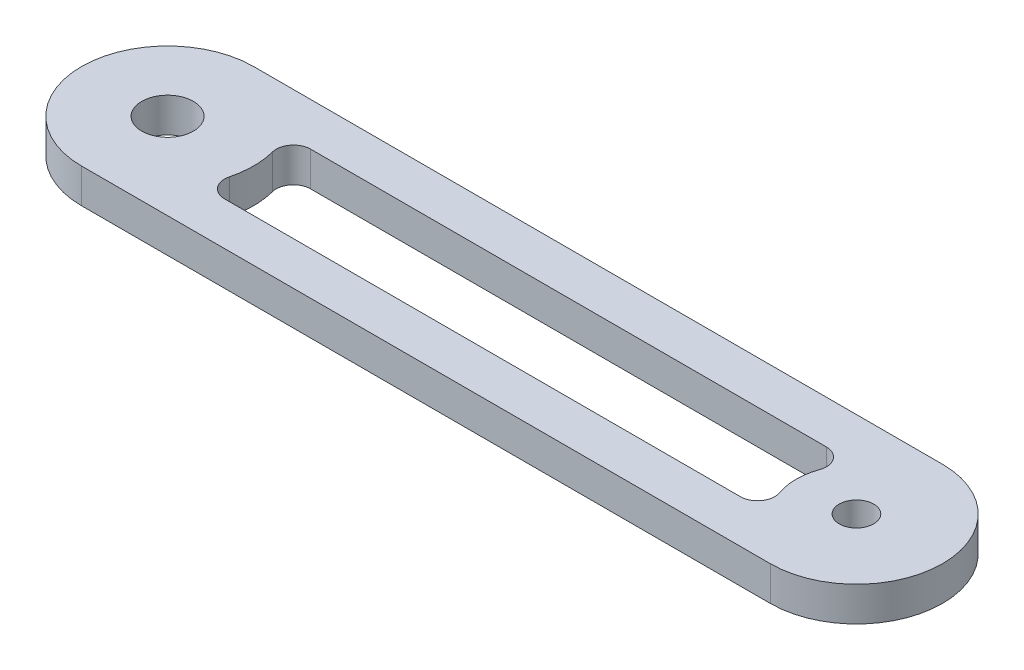
ISO-10303-21;
HEADER;
FILE_DESCRIPTION(('STEP AP214'),'2;1');
FILE_NAME('part.step','',(''),(''),'','','');
FILE_SCHEMA(('AUTOMOTIVE_DESIGN { 1 0 10303 214 1 1 1 1 }'));
ENDSEC;
DATA;
#1=APPLICATION_CONTEXT('core data for automotive mechanical design processes');
#2=APPLICATION_PROTOCOL_DEFINITION('international standard','automotive_design',2000,#1);
#3=PRODUCT_CONTEXT('',#1,'mechanical');
#4=PRODUCT('Part','Part','',(#3));
#5=PRODUCT_RELATED_PRODUCT_CATEGORY('part','',(#4));
#6=PRODUCT_DEFINITION_FORMATION('','',#4);
#7=PRODUCT_DEFINITION_CONTEXT('part definition',#1,'design');
#8=PRODUCT_DEFINITION('design','',#6,#7);
#9=PRODUCT_DEFINITION_SHAPE('','',#8);
#10=(LENGTH_UNIT() NAMED_UNIT(*) SI_UNIT(.MILLI.,.METRE.));
#11=(NAMED_UNIT(*) PLANE_ANGLE_UNIT() SI_UNIT($,.RADIAN.));
#12=(NAMED_UNIT(*) SI_UNIT($,.STERADIAN.) SOLID_ANGLE_UNIT());
#13=UNCERTAINTY_MEASURE_WITH_UNIT(LENGTH_MEASURE(1.E-05),#10,'distance_accuracy_value','');
#14=(GEOMETRIC_REPRESENTATION_CONTEXT(3) GLOBAL_UNCERTAINTY_ASSIGNED_CONTEXT((#13)) GLOBAL_UNIT_ASSIGNED_CONTEXT((#10,
#11,#12)) REPRESENTATION_CONTEXT('',''));
#15=CARTESIAN_POINT('',(0.,0.,0.));
#16=DIRECTION('',(0.,0.,1.));
#17=DIRECTION('',(1.,0.,0.));
#18=AXIS2_PLACEMENT_3D('',#15,#16,#17);
#19=CARTESIAN_POINT('',(-20.,2.,0.));
#20=DIRECTION('',(0.,1.,0.));
#21=DIRECTION('',(0.,0.,1.));
#22=AXIS2_PLACEMENT_3D('',#19,#20,#21);
#23=PLANE('',#22);
#24=CARTESIAN_POINT('',(-20.,2.,0.));
#25=DIRECTION('',(0.,1.,0.));
#26=DIRECTION('',(0.,0.,1.));
#27=AXIS2_PLACEMENT_3D('',#24,#25,#26);
#28=CIRCLE('',#27,5.00000000000001);
#29=CARTESIAN_POINT('',(-20.,2.,-5.00000000000001));
#30=VERTEX_POINT('',#29);
#31=CARTESIAN_POINT('',(-20.,2.,5.00000000000001));
#32=VERTEX_POINT('',#31);
#33=EDGE_CURVE('E184',#30,#32,#28,.T.);
#34=ORIENTED_EDGE('',*,*,#33,.T.);
#35=DIRECTION('',(1.,0.,0.));
#36=VECTOR('',#35,1.);
#37=CARTESIAN_POINT('',(-20.,2.,5.00000000000001));
#38=LINE('',#37,#36);
#39=CARTESIAN_POINT('',(20.,2.,5.));
#40=VERTEX_POINT('',#39);
#41=EDGE_CURVE('E187',#32,#40,#38,.T.);
#42=ORIENTED_EDGE('',*,*,#41,.T.);
#43=CARTESIAN_POINT('',(20.,2.,0.));
#44=DIRECTION('',(0.,1.,0.));
#45=DIRECTION('',(0.,0.,1.));
#46=AXIS2_PLACEMENT_3D('',#43,#44,#45);
#47=CIRCLE('',#46,5.00000000000001);
#48=CARTESIAN_POINT('',(20.,2.,-5.00000000000002));
#49=VERTEX_POINT('',#48);
#50=EDGE_CURVE('E190',#40,#49,#47,.T.);
#51=ORIENTED_EDGE('',*,*,#50,.T.);
#52=DIRECTION('',(1.,0.,0.));
#53=VECTOR('',#52,1.);
#54=CARTESIAN_POINT('',(-20.,2.,-5.00000000000001));
#55=LINE('',#54,#53);
#56=EDGE_CURVE('E192',#30,#49,#55,.T.);
#57=ORIENTED_EDGE('',*,*,#56,.F.);
#58=EDGE_LOOP('',(#34,#42,#51,#57));
#59=FACE_BOUND('',#58,.T.);
#60=CARTESIAN_POINT('',(20.,2.,0.));
#61=DIRECTION('',(0.,1.,0.));
#62=DIRECTION('',(0.,0.,1.));
#63=AXIS2_PLACEMENT_3D('',#60,#61,#62);
#64=CIRCLE('',#63,1.);
#65=CARTESIAN_POINT('',(20.,2.,0.999999999999995));
#66=VERTEX_POINT('',#65);
#67=EDGE_CURVE('E180',#66,#66,#64,.T.);
#68=ORIENTED_EDGE('',*,*,#67,.F.);
#69=EDGE_LOOP('',(#68));
#70=FACE_BOUND('',#69,.T.);
#71=CARTESIAN_POINT('',(-20.,2.,0.));
#72=DIRECTION('',(0.,1.,0.));
#73=DIRECTION('',(0.,0.,1.));
#74=AXIS2_PLACEMENT_3D('',#71,#72,#73);
#75=CIRCLE('',#74,1.5);
#76=CARTESIAN_POINT('',(-20.,2.,1.5));
#77=VERTEX_POINT('',#76);
#78=EDGE_CURVE('E130',#77,#77,#75,.T.);
#79=ORIENTED_EDGE('',*,*,#78,.F.);
#80=EDGE_LOOP('',(#79));
#81=FACE_BOUND('',#80,.T.);
#82=CARTESIAN_POINT('',(-14.1905249806889,2.,1.50000000000001));
#83=DIRECTION('',(0.,1.,0.));
#84=DIRECTION('',(0.,0.,1.));
#85=AXIS2_PLACEMENT_3D('',#82,#83,#84);
#86=CIRCLE('',#85,1.);
#87=CARTESIAN_POINT('',(-14.1905249806889,2.,2.50000000000001));
#88=VERTEX_POINT('',#87);
#89=CARTESIAN_POINT('',(-15.1587708172407,2.,1.25000000000001));
#90=VERTEX_POINT('',#89);
#91=EDGE_CURVE('E134',#88,#90,#86,.F.);
#92=ORIENTED_EDGE('',*,*,#91,.T.);
#93=CARTESIAN_POINT('',(-20.,2.,0.));
#94=DIRECTION('',(0.,1.,0.));
#95=DIRECTION('',(0.,0.,1.));
#96=AXIS2_PLACEMENT_3D('',#93,#94,#95);
#97=CIRCLE('',#96,5.);
#98=CARTESIAN_POINT('',(-15.1587708172407,2.,-1.25000000000001));
#99=VERTEX_POINT('',#98);
#100=EDGE_CURVE('E123',#90,#99,#97,.T.);
#101=ORIENTED_EDGE('',*,*,#100,.T.);
#102=CARTESIAN_POINT('',(-14.1905249806889,2.,-1.50000000000001));
#103=DIRECTION('',(0.,1.,0.));
#104=DIRECTION('',(0.,0.,1.));
#105=AXIS2_PLACEMENT_3D('',#102,#103,#104);
#106=CIRCLE('',#105,1.);
#107=CARTESIAN_POINT('',(-14.1905249806889,2.,-2.50000000000001));
#108=VERTEX_POINT('',#107);
#109=EDGE_CURVE('E268',#99,#108,#106,.F.);
#110=ORIENTED_EDGE('',*,*,#109,.T.);
#111=DIRECTION('',(1.,0.,0.));
#112=VECTOR('',#111,1.);
#113=CARTESIAN_POINT('',(15.7573593128807,2.,-2.50000000000001));
#114=LINE('',#113,#112);
#115=CARTESIAN_POINT('',(15.7573593128807,2.,-2.50000000000001));
#116=VERTEX_POINT('',#115);
#117=EDGE_CURVE('E270',#108,#116,#114,.T.);
#118=ORIENTED_EDGE('',*,*,#117,.T.);
#119=CARTESIAN_POINT('',(15.7573593128807,2.,-1.50000000000001));
#120=DIRECTION('',(0.,1.,0.));
#121=DIRECTION('',(0.,0.,1.));
#122=AXIS2_PLACEMENT_3D('',#119,#120,#121);
#123=CIRCLE('',#122,1.);
#124=CARTESIAN_POINT('',(16.7001683544628,2.,-1.16666666666667));
#125=VERTEX_POINT('',#124);
#126=EDGE_CURVE('E272',#116,#125,#123,.F.);
#127=ORIENTED_EDGE('',*,*,#126,.T.);
#128=CARTESIAN_POINT('',(20.,2.,0.));
#129=DIRECTION('',(0.,1.,0.));
#130=DIRECTION('',(0.,0.,1.));
#131=AXIS2_PLACEMENT_3D('',#128,#129,#130);
#132=CIRCLE('',#131,3.5);
#133=CARTESIAN_POINT('',(16.7001683544628,2.,1.16666666666667));
#134=VERTEX_POINT('',#133);
#135=EDGE_CURVE('E277',#125,#134,#132,.T.);
#136=ORIENTED_EDGE('',*,*,#135,.T.);
#137=CARTESIAN_POINT('',(15.7573593128807,2.,1.50000000000001));
#138=DIRECTION('',(0.,1.,0.));
#139=DIRECTION('',(0.,0.,1.));
#140=AXIS2_PLACEMENT_3D('',#137,#138,#139);
#141=CIRCLE('',#140,1.);
#142=CARTESIAN_POINT('',(15.7573593128807,2.,2.50000000000001));
#143=VERTEX_POINT('',#142);
#144=EDGE_CURVE('E144',#134,#143,#141,.F.);
#145=ORIENTED_EDGE('',*,*,#144,.T.);
#146=DIRECTION('',(-1.,0.,0.));
#147=VECTOR('',#146,1.);
#148=CARTESIAN_POINT('',(15.7573593128807,2.,2.50000000000001));
#149=LINE('',#148,#147);
#150=EDGE_CURVE('E140',#143,#88,#149,.T.);
#151=ORIENTED_EDGE('',*,*,#150,.T.);
#152=EDGE_LOOP('',(#92,#101,#110,#118,#127,#136,#145,#151));
#153=FACE_BOUND('',#152,.T.);
#154=ADVANCED_FACE('F33',(#59,#70,#81,#153),#23,.T.);
#155=CARTESIAN_POINT('',(-20.,0.,0.));
#156=DIRECTION('',(0.,1.,0.));
#157=DIRECTION('',(0.,0.,1.));
#158=AXIS2_PLACEMENT_3D('',#155,#156,#157);
#159=PLANE('',#158);
#160=CARTESIAN_POINT('',(-20.,0.,0.));
#161=DIRECTION('',(0.,1.,0.));
#162=DIRECTION('',(0.,0.,1.));
#163=AXIS2_PLACEMENT_3D('',#160,#161,#162);
#164=CIRCLE('',#163,1.5);
#165=CARTESIAN_POINT('',(-20.,0.,1.5));
#166=VERTEX_POINT('',#165);
#167=EDGE_CURVE('E37',#166,#166,#164,.T.);
#168=ORIENTED_EDGE('',*,*,#167,.T.);
#169=EDGE_LOOP('',(#168));
#170=FACE_BOUND('',#169,.T.);
#171=CARTESIAN_POINT('',(20.,0.,0.));
#172=DIRECTION('',(0.,1.,0.));
#173=DIRECTION('',(0.,0.,1.));
#174=AXIS2_PLACEMENT_3D('',#171,#172,#173);
#175=CIRCLE('',#174,1.);
#176=CARTESIAN_POINT('',(20.,0.,0.999999999999995));
#177=VERTEX_POINT('',#176);
#178=EDGE_CURVE('E183',#177,#177,#175,.T.);
#179=ORIENTED_EDGE('',*,*,#178,.T.);
#180=EDGE_LOOP('',(#179));
#181=FACE_BOUND('',#180,.T.);
#182=CARTESIAN_POINT('',(-20.,0.,0.));
#183=DIRECTION('',(0.,1.,0.));
#184=DIRECTION('',(0.,0.,1.));
#185=AXIS2_PLACEMENT_3D('',#182,#183,#184);
#186=CIRCLE('',#185,5.00000000000001);
#187=CARTESIAN_POINT('',(-20.,0.,-5.00000000000001));
#188=VERTEX_POINT('',#187);
#189=CARTESIAN_POINT('',(-20.,0.,5.00000000000001));
#190=VERTEX_POINT('',#189);
#191=EDGE_CURVE('E196',#188,#190,#186,.T.);
#192=ORIENTED_EDGE('',*,*,#191,.F.);
#193=DIRECTION('',(1.,0.,0.));
#194=VECTOR('',#193,1.);
#195=CARTESIAN_POINT('',(-20.,0.,-5.00000000000001));
#196=LINE('',#195,#194);
#197=CARTESIAN_POINT('',(20.,0.,-5.00000000000002));
#198=VERTEX_POINT('',#197);
#199=EDGE_CURVE('E188',#188,#198,#196,.T.);
#200=ORIENTED_EDGE('',*,*,#199,.T.);
#201=CARTESIAN_POINT('',(20.,0.,0.));
#202=DIRECTION('',(0.,1.,0.));
#203=DIRECTION('',(0.,0.,1.));
#204=AXIS2_PLACEMENT_3D('',#201,#202,#203);
#205=CIRCLE('',#204,5.00000000000001);
#206=CARTESIAN_POINT('',(20.,0.,5.));
#207=VERTEX_POINT('',#206);
#208=EDGE_CURVE('E201',#207,#198,#205,.T.);
#209=ORIENTED_EDGE('',*,*,#208,.F.);
#210=DIRECTION('',(1.,0.,0.));
#211=VECTOR('',#210,1.);
#212=CARTESIAN_POINT('',(-20.,0.,5.00000000000001));
#213=LINE('',#212,#211);
#214=EDGE_CURVE('E199',#190,#207,#213,.T.);
#215=ORIENTED_EDGE('',*,*,#214,.F.);
#216=EDGE_LOOP('',(#192,#200,#209,#215));
#217=FACE_BOUND('',#216,.T.);
#218=CARTESIAN_POINT('',(-20.,0.,0.));
#219=DIRECTION('',(0.,1.,0.));
#220=DIRECTION('',(0.,0.,-1.));
#221=AXIS2_PLACEMENT_3D('',#218,#219,#220);
#222=CIRCLE('',#221,5.);
#223=CARTESIAN_POINT('',(-15.1587708172407,0.,1.25000000000001));
#224=VERTEX_POINT('',#223);
#225=CARTESIAN_POINT('',(-15.1587708172407,0.,-1.25000000000001));
#226=VERTEX_POINT('',#225);
#227=EDGE_CURVE('E142',#224,#226,#222,.T.);
#228=ORIENTED_EDGE('',*,*,#227,.F.);
#229=CARTESIAN_POINT('',(-14.1905249806889,0.,1.50000000000001));
#230=DIRECTION('',(0.,-1.,0.));
#231=DIRECTION('',(0.,0.,-1.));
#232=AXIS2_PLACEMENT_3D('',#229,#230,#231);
#233=CIRCLE('',#232,1.);
#234=CARTESIAN_POINT('',(-14.1905249806889,0.,2.50000000000001));
#235=VERTEX_POINT('',#234);
#236=EDGE_CURVE('E58',#235,#224,#233,.T.);
#237=ORIENTED_EDGE('',*,*,#236,.F.);
#238=DIRECTION('',(-1.,0.,0.));
#239=VECTOR('',#238,1.);
#240=CARTESIAN_POINT('',(15.7573593128807,0.,2.50000000000001));
#241=LINE('',#240,#239);
#242=CARTESIAN_POINT('',(15.7573593128807,0.,2.50000000000001));
#243=VERTEX_POINT('',#242);
#244=EDGE_CURVE('E136',#243,#235,#241,.T.);
#245=ORIENTED_EDGE('',*,*,#244,.F.);
#246=CARTESIAN_POINT('',(15.7573593128807,0.,1.50000000000001));
#247=DIRECTION('',(0.,-1.,0.));
#248=DIRECTION('',(0.,0.,-1.));
#249=AXIS2_PLACEMENT_3D('',#246,#247,#248);
#250=CIRCLE('',#249,1.);
#251=CARTESIAN_POINT('',(16.7001683544628,0.,1.16666666666667));
#252=VERTEX_POINT('',#251);
#253=EDGE_CURVE('E161',#252,#243,#250,.T.);
#254=ORIENTED_EDGE('',*,*,#253,.F.);
#255=CARTESIAN_POINT('',(20.,0.,0.));
#256=DIRECTION('',(0.,1.,0.));
#257=DIRECTION('',(0.,0.,-1.));
#258=AXIS2_PLACEMENT_3D('',#255,#256,#257);
#259=CIRCLE('',#258,3.5);
#260=CARTESIAN_POINT('',(16.7001683544628,0.,-1.16666666666667));
#261=VERTEX_POINT('',#260);
#262=EDGE_CURVE('E158',#261,#252,#259,.T.);
#263=ORIENTED_EDGE('',*,*,#262,.F.);
#264=CARTESIAN_POINT('',(15.7573593128807,0.,-1.50000000000001));
#265=DIRECTION('',(0.,-1.,0.));
#266=DIRECTION('',(0.,0.,-1.));
#267=AXIS2_PLACEMENT_3D('',#264,#265,#266);
#268=CIRCLE('',#267,1.);
#269=CARTESIAN_POINT('',(15.7573593128807,0.,-2.50000000000001));
#270=VERTEX_POINT('',#269);
#271=EDGE_CURVE('E155',#270,#261,#268,.T.);
#272=ORIENTED_EDGE('',*,*,#271,.F.);
#273=DIRECTION('',(1.,0.,0.));
#274=VECTOR('',#273,1.);
#275=CARTESIAN_POINT('',(15.7573593128807,0.,-2.50000000000001));
#276=LINE('',#275,#274);
#277=CARTESIAN_POINT('',(-14.1905249806889,0.,-2.50000000000001));
#278=VERTEX_POINT('',#277);
#279=EDGE_CURVE('E152',#278,#270,#276,.T.);
#280=ORIENTED_EDGE('',*,*,#279,.F.);
#281=CARTESIAN_POINT('',(-14.1905249806889,0.,-1.50000000000001));
#282=DIRECTION('',(0.,-1.,0.));
#283=DIRECTION('',(0.,0.,1.));
#284=AXIS2_PLACEMENT_3D('',#281,#282,#283);
#285=CIRCLE('',#284,1.);
#286=EDGE_CURVE('E149',#226,#278,#285,.T.);
#287=ORIENTED_EDGE('',*,*,#286,.F.);
#288=EDGE_LOOP('',(#228,#237,#245,#254,#263,#272,#280,#287));
#289=FACE_BOUND('',#288,.T.);
#290=ADVANCED_FACE('F213',(#170,#181,#217,#289),#159,.F.);
#291=CARTESIAN_POINT('',(-20.,2.,0.));
#292=DIRECTION('',(0.,-1.,0.));
#293=DIRECTION('',(0.,0.,-1.));
#294=AXIS2_PLACEMENT_3D('',#291,#292,#293);
#295=CYLINDRICAL_SURFACE('',#294,5.00000000000001);
#296=ORIENTED_EDGE('',*,*,#191,.T.);
#297=DIRECTION('',(0.,-1.,0.));
#298=VECTOR('',#297,1.);
#299=CARTESIAN_POINT('',(-20.,2.,5.00000000000001));
#300=LINE('',#299,#298);
#301=EDGE_CURVE('E11',#32,#190,#300,.T.);
#302=ORIENTED_EDGE('',*,*,#301,.F.);
#303=ORIENTED_EDGE('',*,*,#33,.F.);
#304=DIRECTION('',(0.,-1.,0.));
#305=VECTOR('',#304,1.);
#306=CARTESIAN_POINT('',(-20.,2.,-5.00000000000001));
#307=LINE('',#306,#305);
#308=EDGE_CURVE('E195',#30,#188,#307,.T.);
#309=ORIENTED_EDGE('',*,*,#308,.T.);
#310=EDGE_LOOP('',(#296,#302,#303,#309));
#311=FACE_BOUND('',#310,.T.);
#312=ADVANCED_FACE('F35',(#311),#295,.T.);
#313=CARTESIAN_POINT('',(-20.,2.,5.00000000000001));
#314=DIRECTION('',(0.,0.,-1.));
#315=DIRECTION('',(-1.,0.,0.));
#316=AXIS2_PLACEMENT_3D('',#313,#314,#315);
#317=PLANE('',#316);
#318=ORIENTED_EDGE('',*,*,#214,.T.);
#319=DIRECTION('',(0.,-1.,0.));
#320=VECTOR('',#319,1.);
#321=CARTESIAN_POINT('',(20.,2.,5.));
#322=LINE('',#321,#320);
#323=EDGE_CURVE('E42',#40,#207,#322,.T.);
#324=ORIENTED_EDGE('',*,*,#323,.F.);
#325=ORIENTED_EDGE('',*,*,#41,.F.);
#326=ORIENTED_EDGE('',*,*,#301,.T.);
#327=EDGE_LOOP('',(#318,#324,#325,#326));
#328=FACE_BOUND('',#327,.T.);
#329=ADVANCED_FACE('F243',(#328),#317,.F.);
#330=CARTESIAN_POINT('',(20.,2.,0.));
#331=DIRECTION('',(0.,-1.,0.));
#332=DIRECTION('',(0.,0.,-1.));
#333=AXIS2_PLACEMENT_3D('',#330,#331,#332);
#334=CYLINDRICAL_SURFACE('',#333,5.00000000000001);
#335=ORIENTED_EDGE('',*,*,#208,.T.);
#336=DIRECTION('',(0.,-1.,0.));
#337=VECTOR('',#336,1.);
#338=CARTESIAN_POINT('',(20.,2.,-5.00000000000002));
#339=LINE('',#338,#337);
#340=EDGE_CURVE('E207',#49,#198,#339,.T.);
#341=ORIENTED_EDGE('',*,*,#340,.F.);
#342=ORIENTED_EDGE('',*,*,#50,.F.);
#343=ORIENTED_EDGE('',*,*,#323,.T.);
#344=EDGE_LOOP('',(#335,#341,#342,#343));
#345=FACE_BOUND('',#344,.T.);
#346=ADVANCED_FACE('F228',(#345),#334,.T.);
#347=CARTESIAN_POINT('',(-20.,2.,-5.00000000000001));
#348=DIRECTION('',(0.,0.,-1.));
#349=DIRECTION('',(-1.,0.,0.));
#350=AXIS2_PLACEMENT_3D('',#347,#348,#349);
#351=PLANE('',#350);
#352=ORIENTED_EDGE('',*,*,#199,.F.);
#353=ORIENTED_EDGE('',*,*,#308,.F.);
#354=ORIENTED_EDGE('',*,*,#56,.T.);
#355=ORIENTED_EDGE('',*,*,#340,.T.);
#356=EDGE_LOOP('',(#352,#353,#354,#355));
#357=FACE_BOUND('',#356,.T.);
#358=ADVANCED_FACE('F219',(#357),#351,.T.);
#359=CARTESIAN_POINT('',(20.,-10.7,0.));
#360=DIRECTION('',(0.,1.,0.));
#361=DIRECTION('',(0.,0.,1.));
#362=AXIS2_PLACEMENT_3D('',#359,#360,#361);
#363=CYLINDRICAL_SURFACE('',#362,1.);
#364=ORIENTED_EDGE('',*,*,#67,.T.);
#365=EDGE_LOOP('',(#364));
#366=FACE_BOUND('',#365,.T.);
#367=ORIENTED_EDGE('',*,*,#178,.F.);
#368=EDGE_LOOP('',(#367));
#369=FACE_BOUND('',#368,.T.);
#370=ADVANCED_FACE('F216',(#366,#369),#363,.F.);
#371=CARTESIAN_POINT('',(-20.,-8.,0.));
#372=DIRECTION('',(0.,1.,0.));
#373=DIRECTION('',(0.,0.,1.));
#374=AXIS2_PLACEMENT_3D('',#371,#372,#373);
#375=CYLINDRICAL_SURFACE('',#374,1.5);
#376=ORIENTED_EDGE('',*,*,#78,.T.);
#377=EDGE_LOOP('',(#376));
#378=FACE_BOUND('',#377,.T.);
#379=ORIENTED_EDGE('',*,*,#167,.F.);
#380=EDGE_LOOP('',(#379));
#381=FACE_BOUND('',#380,.T.);
#382=ADVANCED_FACE('F218',(#378,#381),#375,.F.);
#383=CARTESIAN_POINT('',(-14.1905249806889,2.001,1.50000000000001));
#384=DIRECTION('',(0.,-1.,0.));
#385=DIRECTION('',(0.,0.,-1.));
#386=AXIS2_PLACEMENT_3D('',#383,#384,#385);
#387=CYLINDRICAL_SURFACE('',#386,1.);
#388=DIRECTION('',(0.,-1.,0.));
#389=VECTOR('',#388,1.);
#390=CARTESIAN_POINT('',(-14.1905249806889,2.001,2.50000000000001));
#391=LINE('',#390,#389);
#392=EDGE_CURVE('E131',#88,#235,#391,.T.);
#393=ORIENTED_EDGE('',*,*,#392,.T.);
#394=ORIENTED_EDGE('',*,*,#236,.T.);
#395=DIRECTION('',(0.,-1.,0.));
#396=VECTOR('',#395,1.);
#397=CARTESIAN_POINT('',(-15.1587708172407,2.001,1.25000000000001));
#398=LINE('',#397,#396);
#399=EDGE_CURVE('E125',#90,#224,#398,.T.);
#400=ORIENTED_EDGE('',*,*,#399,.F.);
#401=ORIENTED_EDGE('',*,*,#91,.F.);
#402=EDGE_LOOP('',(#393,#394,#400,#401));
#403=FACE_BOUND('',#402,.T.);
#404=ADVANCED_FACE('F133',(#403),#387,.F.);
#405=CARTESIAN_POINT('',(15.7573593128807,2.001,2.50000000000001));
#406=DIRECTION('',(0.,0.,1.));
#407=DIRECTION('',(1.,0.,0.));
#408=AXIS2_PLACEMENT_3D('',#405,#406,#407);
#409=PLANE('',#408);
#410=DIRECTION('',(0.,-1.,0.));
#411=VECTOR('',#410,1.);
#412=CARTESIAN_POINT('',(15.7573593128807,2.001,2.50000000000001));
#413=LINE('',#412,#411);
#414=EDGE_CURVE('E167',#143,#243,#413,.T.);
#415=ORIENTED_EDGE('',*,*,#414,.T.);
#416=ORIENTED_EDGE('',*,*,#244,.T.);
#417=ORIENTED_EDGE('',*,*,#392,.F.);
#418=ORIENTED_EDGE('',*,*,#150,.F.);
#419=EDGE_LOOP('',(#415,#416,#417,#418));
#420=FACE_BOUND('',#419,.T.);
#421=ADVANCED_FACE('F289',(#420),#409,.F.);
#422=CARTESIAN_POINT('',(15.7573593128807,2.001,1.50000000000001));
#423=DIRECTION('',(0.,-1.,0.));
#424=DIRECTION('',(0.,0.,-1.));
#425=AXIS2_PLACEMENT_3D('',#422,#423,#424);
#426=CYLINDRICAL_SURFACE('',#425,1.);
#427=DIRECTION('',(0.,-1.,0.));
#428=VECTOR('',#427,1.);
#429=CARTESIAN_POINT('',(16.7001683544628,2.001,1.16666666666667));
#430=LINE('',#429,#428);
#431=EDGE_CURVE('E169',#134,#252,#430,.T.);
#432=ORIENTED_EDGE('',*,*,#431,.T.);
#433=ORIENTED_EDGE('',*,*,#253,.T.);
#434=ORIENTED_EDGE('',*,*,#414,.F.);
#435=ORIENTED_EDGE('',*,*,#144,.F.);
#436=EDGE_LOOP('',(#432,#433,#434,#435));
#437=FACE_BOUND('',#436,.T.);
#438=ADVANCED_FACE('F282',(#437),#426,.F.);
#439=CARTESIAN_POINT('',(20.,2.001,0.));
#440=DIRECTION('',(0.,-1.,0.));
#441=DIRECTION('',(0.,0.,-1.));
#442=AXIS2_PLACEMENT_3D('',#439,#440,#441);
#443=CYLINDRICAL_SURFACE('',#442,3.5);
#444=DIRECTION('',(0.,-1.,0.));
#445=VECTOR('',#444,1.);
#446=CARTESIAN_POINT('',(16.7001683544628,2.001,-1.16666666666667));
#447=LINE('',#446,#445);
#448=EDGE_CURVE('E171',#125,#261,#447,.T.);
#449=ORIENTED_EDGE('',*,*,#448,.T.);
#450=ORIENTED_EDGE('',*,*,#262,.T.);
#451=ORIENTED_EDGE('',*,*,#431,.F.);
#452=ORIENTED_EDGE('',*,*,#135,.F.);
#453=EDGE_LOOP('',(#449,#450,#451,#452));
#454=FACE_BOUND('',#453,.T.);
#455=ADVANCED_FACE('F284',(#454),#443,.T.);
#456=CARTESIAN_POINT('',(15.7573593128807,2.001,-1.50000000000001));
#457=DIRECTION('',(0.,-1.,0.));
#458=DIRECTION('',(0.,0.,-1.));
#459=AXIS2_PLACEMENT_3D('',#456,#457,#458);
#460=CYLINDRICAL_SURFACE('',#459,1.);
#461=DIRECTION('',(0.,-1.,0.));
#462=VECTOR('',#461,1.);
#463=CARTESIAN_POINT('',(15.7573593128807,2.001,-2.50000000000001));
#464=LINE('',#463,#462);
#465=EDGE_CURVE('E173',#116,#270,#464,.T.);
#466=ORIENTED_EDGE('',*,*,#465,.T.);
#467=ORIENTED_EDGE('',*,*,#271,.T.);
#468=ORIENTED_EDGE('',*,*,#448,.F.);
#469=ORIENTED_EDGE('',*,*,#126,.F.);
#470=EDGE_LOOP('',(#466,#467,#468,#469));
#471=FACE_BOUND('',#470,.T.);
#472=ADVANCED_FACE('F301',(#471),#460,.F.);
#473=CARTESIAN_POINT('',(15.7573593128807,2.001,-2.50000000000001));
#474=DIRECTION('',(0.,0.,-1.));
#475=DIRECTION('',(-1.,0.,0.));
#476=AXIS2_PLACEMENT_3D('',#473,#474,#475);
#477=PLANE('',#476);
#478=DIRECTION('',(0.,-1.,0.));
#479=VECTOR('',#478,1.);
#480=CARTESIAN_POINT('',(-14.1905249806889,2.001,-2.50000000000001));
#481=LINE('',#480,#479);
#482=EDGE_CURVE('E175',#108,#278,#481,.T.);
#483=ORIENTED_EDGE('',*,*,#482,.T.);
#484=ORIENTED_EDGE('',*,*,#279,.T.);
#485=ORIENTED_EDGE('',*,*,#465,.F.);
#486=ORIENTED_EDGE('',*,*,#117,.F.);
#487=EDGE_LOOP('',(#483,#484,#485,#486));
#488=FACE_BOUND('',#487,.T.);
#489=ADVANCED_FACE('F304',(#488),#477,.F.);
#490=CARTESIAN_POINT('',(-14.1905249806889,2.001,-1.50000000000001));
#491=DIRECTION('',(0.,-1.,0.));
#492=DIRECTION('',(0.,0.,-1.));
#493=AXIS2_PLACEMENT_3D('',#490,#491,#492);
#494=CYLINDRICAL_SURFACE('',#493,1.);
#495=DIRECTION('',(0.,-1.,0.));
#496=VECTOR('',#495,1.);
#497=CARTESIAN_POINT('',(-15.1587708172407,2.001,-1.25000000000001));
#498=LINE('',#497,#496);
#499=EDGE_CURVE('E50',#99,#226,#498,.T.);
#500=ORIENTED_EDGE('',*,*,#499,.T.);
#501=ORIENTED_EDGE('',*,*,#286,.T.);
#502=ORIENTED_EDGE('',*,*,#482,.F.);
#503=ORIENTED_EDGE('',*,*,#109,.F.);
#504=EDGE_LOOP('',(#500,#501,#502,#503));
#505=FACE_BOUND('',#504,.T.);
#506=ADVANCED_FACE('F267',(#505),#494,.F.);
#507=CARTESIAN_POINT('',(-20.,2.001,0.));
#508=DIRECTION('',(0.,-1.,0.));
#509=DIRECTION('',(0.,0.,-1.));
#510=AXIS2_PLACEMENT_3D('',#507,#508,#509);
#511=CYLINDRICAL_SURFACE('',#510,5.);
#512=ORIENTED_EDGE('',*,*,#399,.T.);
#513=ORIENTED_EDGE('',*,*,#227,.T.);
#514=ORIENTED_EDGE('',*,*,#499,.F.);
#515=ORIENTED_EDGE('',*,*,#100,.F.);
#516=EDGE_LOOP('',(#512,#513,#514,#515));
#517=FACE_BOUND('',#516,.T.);
#518=ADVANCED_FACE('F124',(#517),#511,.T.);
#519=CLOSED_SHELL('',(#154,#290,#312,#329,#346,#358,#370,#382,#404,#421,#438,#455,#472,#489,
#506,#518));
#520=MANIFOLD_SOLID_BREP('B2',#519);
#521=ADVANCED_BREP_SHAPE_REPRESENTATION('',(#18,#520),#14);
#522=SHAPE_DEFINITION_REPRESENTATION(#9,#521);
ENDSEC;
END-ISO-10303-21;
